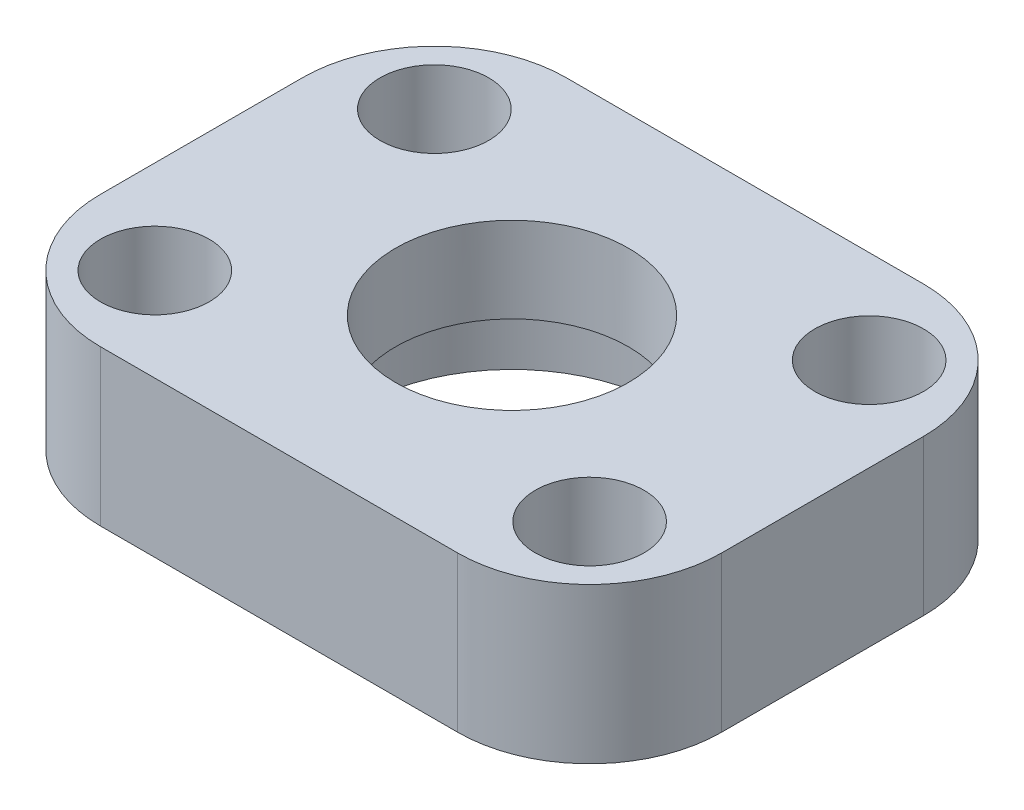
ISO-10303-21;
HEADER;
FILE_DESCRIPTION(('STEP AP214'),'2;1');
FILE_NAME('part.step','',(''),(''),'','','');
FILE_SCHEMA(('AUTOMOTIVE_DESIGN { 1 0 10303 214 1 1 1 1 }'));
ENDSEC;
DATA;
#1=APPLICATION_CONTEXT('core data for automotive mechanical design processes');
#2=APPLICATION_PROTOCOL_DEFINITION('international standard','automotive_design',2000,#1);
#3=PRODUCT_CONTEXT('',#1,'mechanical');
#4=PRODUCT('Part','Part','',(#3));
#5=PRODUCT_RELATED_PRODUCT_CATEGORY('part','',(#4));
#6=PRODUCT_DEFINITION_FORMATION('','',#4);
#7=PRODUCT_DEFINITION_CONTEXT('part definition',#1,'design');
#8=PRODUCT_DEFINITION('design','',#6,#7);
#9=PRODUCT_DEFINITION_SHAPE('','',#8);
#10=(LENGTH_UNIT() NAMED_UNIT(*) SI_UNIT(.MILLI.,.METRE.));
#11=(NAMED_UNIT(*) PLANE_ANGLE_UNIT() SI_UNIT($,.RADIAN.));
#12=(NAMED_UNIT(*) SI_UNIT($,.STERADIAN.) SOLID_ANGLE_UNIT());
#13=UNCERTAINTY_MEASURE_WITH_UNIT(LENGTH_MEASURE(1.E-05),#10,'distance_accuracy_value','');
#14=(GEOMETRIC_REPRESENTATION_CONTEXT(3) GLOBAL_UNCERTAINTY_ASSIGNED_CONTEXT((#13)) GLOBAL_UNIT_ASSIGNED_CONTEXT((#10,
#11,#12)) REPRESENTATION_CONTEXT('',''));
#15=CARTESIAN_POINT('',(0.,0.,0.));
#16=DIRECTION('',(0.,0.,1.));
#17=DIRECTION('',(1.,0.,0.));
#18=AXIS2_PLACEMENT_3D('',#15,#16,#17);
#19=CARTESIAN_POINT('',(14.,10.,-9.));
#20=DIRECTION('',(0.,1.,0.));
#21=DIRECTION('',(0.,0.,1.));
#22=AXIS2_PLACEMENT_3D('',#19,#20,#21);
#23=CYLINDRICAL_SURFACE('',#22,1.5);
#24=CARTESIAN_POINT('',(14.,0.,-9.));
#25=DIRECTION('',(0.,1.,0.));
#26=DIRECTION('',(0.,0.,1.));
#27=AXIS2_PLACEMENT_3D('',#24,#25,#26);
#28=CIRCLE('',#27,1.5);
#29=CARTESIAN_POINT('',(14.,0.,-7.5));
#30=VERTEX_POINT('',#29);
#31=EDGE_CURVE('E197',#30,#30,#28,.T.);
#32=ORIENTED_EDGE('',*,*,#31,.F.);
#33=EDGE_LOOP('',(#32));
#34=FACE_BOUND('',#33,.T.);
#35=CARTESIAN_POINT('',(14.,5.,-9.));
#36=DIRECTION('',(0.,1.,0.));
#37=DIRECTION('',(0.,0.,1.));
#38=AXIS2_PLACEMENT_3D('',#35,#36,#37);
#39=CIRCLE('',#38,1.5);
#40=CARTESIAN_POINT('',(14.,5.,-7.5));
#41=VERTEX_POINT('',#40);
#42=EDGE_CURVE('E40',#41,#41,#39,.F.);
#43=ORIENTED_EDGE('',*,*,#42,.F.);
#44=EDGE_LOOP('',(#43));
#45=FACE_BOUND('',#44,.T.);
#46=ADVANCED_FACE('F36',(#34,#45),#23,.F.);
#47=CARTESIAN_POINT('',(14.,10.,9.));
#48=DIRECTION('',(0.,1.,0.));
#49=DIRECTION('',(0.,0.,1.));
#50=AXIS2_PLACEMENT_3D('',#47,#48,#49);
#51=CYLINDRICAL_SURFACE('',#50,1.5);
#52=CARTESIAN_POINT('',(14.,0.,9.));
#53=DIRECTION('',(0.,1.,0.));
#54=DIRECTION('',(0.,0.,1.));
#55=AXIS2_PLACEMENT_3D('',#52,#53,#54);
#56=CIRCLE('',#55,1.5);
#57=CARTESIAN_POINT('',(14.,0.,10.5));
#58=VERTEX_POINT('',#57);
#59=EDGE_CURVE('E189',#58,#58,#56,.T.);
#60=ORIENTED_EDGE('',*,*,#59,.F.);
#61=EDGE_LOOP('',(#60));
#62=FACE_BOUND('',#61,.T.);
#63=CARTESIAN_POINT('',(14.,5.,9.));
#64=DIRECTION('',(0.,1.,0.));
#65=DIRECTION('',(0.,0.,1.));
#66=AXIS2_PLACEMENT_3D('',#63,#64,#65);
#67=CIRCLE('',#66,1.5);
#68=CARTESIAN_POINT('',(14.,5.,10.5));
#69=VERTEX_POINT('',#68);
#70=EDGE_CURVE('E175',#69,#69,#67,.F.);
#71=ORIENTED_EDGE('',*,*,#70,.F.);
#72=EDGE_LOOP('',(#71));
#73=FACE_BOUND('',#72,.T.);
#74=ADVANCED_FACE('F240',(#62,#73),#51,.F.);
#75=CARTESIAN_POINT('',(-14.,10.,9.));
#76=DIRECTION('',(0.,1.,0.));
#77=DIRECTION('',(0.,0.,1.));
#78=AXIS2_PLACEMENT_3D('',#75,#76,#77);
#79=CYLINDRICAL_SURFACE('',#78,1.5);
#80=CARTESIAN_POINT('',(-14.,0.,9.));
#81=DIRECTION('',(0.,1.,0.));
#82=DIRECTION('',(0.,0.,1.));
#83=AXIS2_PLACEMENT_3D('',#80,#81,#82);
#84=CIRCLE('',#83,1.5);
#85=CARTESIAN_POINT('',(-14.,0.,10.5));
#86=VERTEX_POINT('',#85);
#87=EDGE_CURVE('E184',#86,#86,#84,.T.);
#88=ORIENTED_EDGE('',*,*,#87,.F.);
#89=EDGE_LOOP('',(#88));
#90=FACE_BOUND('',#89,.T.);
#91=CARTESIAN_POINT('',(-14.,5.,9.));
#92=DIRECTION('',(0.,1.,0.));
#93=DIRECTION('',(0.,0.,1.));
#94=AXIS2_PLACEMENT_3D('',#91,#92,#93);
#95=CIRCLE('',#94,1.5);
#96=CARTESIAN_POINT('',(-14.,5.,10.5));
#97=VERTEX_POINT('',#96);
#98=EDGE_CURVE('E172',#97,#97,#95,.F.);
#99=ORIENTED_EDGE('',*,*,#98,.F.);
#100=EDGE_LOOP('',(#99));
#101=FACE_BOUND('',#100,.T.);
#102=ADVANCED_FACE('F246',(#90,#101),#79,.F.);
#103=CARTESIAN_POINT('',(-14.,10.,-9.));
#104=DIRECTION('',(0.,1.,0.));
#105=DIRECTION('',(0.,0.,1.));
#106=AXIS2_PLACEMENT_3D('',#103,#104,#105);
#107=CYLINDRICAL_SURFACE('',#106,1.5);
#108=CARTESIAN_POINT('',(-14.,0.,-9.));
#109=DIRECTION('',(0.,1.,0.));
#110=DIRECTION('',(0.,0.,1.));
#111=AXIS2_PLACEMENT_3D('',#108,#109,#110);
#112=CIRCLE('',#111,1.5);
#113=CARTESIAN_POINT('',(-14.,0.,-7.5));
#114=VERTEX_POINT('',#113);
#115=EDGE_CURVE('E180',#114,#114,#112,.T.);
#116=ORIENTED_EDGE('',*,*,#115,.F.);
#117=EDGE_LOOP('',(#116));
#118=FACE_BOUND('',#117,.T.);
#119=CARTESIAN_POINT('',(-14.,5.,-9.));
#120=DIRECTION('',(0.,1.,0.));
#121=DIRECTION('',(0.,0.,1.));
#122=AXIS2_PLACEMENT_3D('',#119,#120,#121);
#123=CIRCLE('',#122,1.5);
#124=CARTESIAN_POINT('',(-14.,5.,-7.5));
#125=VERTEX_POINT('',#124);
#126=EDGE_CURVE('E169',#125,#125,#123,.F.);
#127=ORIENTED_EDGE('',*,*,#126,.F.);
#128=EDGE_LOOP('',(#127));
#129=FACE_BOUND('',#128,.T.);
#130=ADVANCED_FACE('F278',(#118,#129),#107,.F.);
#131=CARTESIAN_POINT('',(20.,10.,-15.));
#132=DIRECTION('',(-1.,0.,0.));
#133=DIRECTION('',(0.,0.,1.));
#134=AXIS2_PLACEMENT_3D('',#131,#132,#133);
#135=PLANE('',#134);
#136=DIRECTION('',(0.,0.,-1.));
#137=VECTOR('',#136,1.);
#138=CARTESIAN_POINT('',(20.,0.,-15.));
#139=LINE('',#138,#137);
#140=CARTESIAN_POINT('',(20.,0.,6.5));
#141=VERTEX_POINT('',#140);
#142=CARTESIAN_POINT('',(20.,0.,-6.5));
#143=VERTEX_POINT('',#142);
#144=EDGE_CURVE('E131',#141,#143,#139,.T.);
#145=ORIENTED_EDGE('',*,*,#144,.T.);
#146=DIRECTION('',(0.,-1.,0.));
#147=VECTOR('',#146,1.);
#148=CARTESIAN_POINT('',(20.,10.,-6.5));
#149=LINE('',#148,#147);
#150=CARTESIAN_POINT('',(20.,10.,-6.5));
#151=VERTEX_POINT('',#150);
#152=EDGE_CURVE('E109',#143,#151,#149,.F.);
#153=ORIENTED_EDGE('',*,*,#152,.T.);
#154=DIRECTION('',(0.,0.,-1.));
#155=VECTOR('',#154,1.);
#156=CARTESIAN_POINT('',(20.,10.,-15.));
#157=LINE('',#156,#155);
#158=CARTESIAN_POINT('',(20.,10.,6.5));
#159=VERTEX_POINT('',#158);
#160=EDGE_CURVE('E141',#159,#151,#157,.T.);
#161=ORIENTED_EDGE('',*,*,#160,.F.);
#162=DIRECTION('',(0.,-1.,0.));
#163=VECTOR('',#162,1.);
#164=CARTESIAN_POINT('',(20.,10.,6.5));
#165=LINE('',#164,#163);
#166=EDGE_CURVE('E114',#159,#141,#165,.T.);
#167=ORIENTED_EDGE('',*,*,#166,.T.);
#168=EDGE_LOOP('',(#145,#153,#161,#167));
#169=FACE_BOUND('',#168,.T.);
#170=ADVANCED_FACE('F218',(#169),#135,.F.);
#171=CARTESIAN_POINT('',(-20.,10.,-15.));
#172=DIRECTION('',(0.,0.,1.));
#173=DIRECTION('',(1.,0.,0.));
#174=AXIS2_PLACEMENT_3D('',#171,#172,#173);
#175=PLANE('',#174);
#176=DIRECTION('',(-1.,0.,0.));
#177=VECTOR('',#176,1.);
#178=CARTESIAN_POINT('',(-20.,10.,-15.));
#179=LINE('',#178,#177);
#180=CARTESIAN_POINT('',(11.5,10.,-15.));
#181=VERTEX_POINT('',#180);
#182=CARTESIAN_POINT('',(-11.5,10.,-15.));
#183=VERTEX_POINT('',#182);
#184=EDGE_CURVE('E124',#181,#183,#179,.T.);
#185=ORIENTED_EDGE('',*,*,#184,.F.);
#186=DIRECTION('',(0.,-1.,0.));
#187=VECTOR('',#186,1.);
#188=CARTESIAN_POINT('',(11.5,10.,-15.));
#189=LINE('',#188,#187);
#190=CARTESIAN_POINT('',(11.5,0.,-15.));
#191=VERTEX_POINT('',#190);
#192=EDGE_CURVE('E108',#181,#191,#189,.T.);
#193=ORIENTED_EDGE('',*,*,#192,.T.);
#194=DIRECTION('',(-1.,0.,0.));
#195=VECTOR('',#194,1.);
#196=CARTESIAN_POINT('',(-20.,0.,-15.));
#197=LINE('',#196,#195);
#198=CARTESIAN_POINT('',(-11.5,0.,-15.));
#199=VERTEX_POINT('',#198);
#200=EDGE_CURVE('E121',#191,#199,#197,.T.);
#201=ORIENTED_EDGE('',*,*,#200,.T.);
#202=DIRECTION('',(0.,-1.,0.));
#203=VECTOR('',#202,1.);
#204=CARTESIAN_POINT('',(-11.5,10.,-15.));
#205=LINE('',#204,#203);
#206=EDGE_CURVE('E126',#199,#183,#205,.F.);
#207=ORIENTED_EDGE('',*,*,#206,.T.);
#208=EDGE_LOOP('',(#185,#193,#201,#207));
#209=FACE_BOUND('',#208,.T.);
#210=ADVANCED_FACE('F120',(#209),#175,.F.);
#211=CARTESIAN_POINT('',(-20.,10.,-15.));
#212=DIRECTION('',(1.,0.,0.));
#213=DIRECTION('',(0.,0.,-1.));
#214=AXIS2_PLACEMENT_3D('',#211,#212,#213);
#215=PLANE('',#214);
#216=DIRECTION('',(0.,0.,1.));
#217=VECTOR('',#216,1.);
#218=CARTESIAN_POINT('',(-20.,0.,-15.));
#219=LINE('',#218,#217);
#220=CARTESIAN_POINT('',(-20.,0.,-6.5));
#221=VERTEX_POINT('',#220);
#222=CARTESIAN_POINT('',(-20.,0.,6.5));
#223=VERTEX_POINT('',#222);
#224=EDGE_CURVE('E130',#221,#223,#219,.T.);
#225=ORIENTED_EDGE('',*,*,#224,.T.);
#226=DIRECTION('',(0.,-1.,0.));
#227=VECTOR('',#226,1.);
#228=CARTESIAN_POINT('',(-20.,10.,6.5));
#229=LINE('',#228,#227);
#230=CARTESIAN_POINT('',(-20.,10.,6.5));
#231=VERTEX_POINT('',#230);
#232=EDGE_CURVE('E11',#223,#231,#229,.F.);
#233=ORIENTED_EDGE('',*,*,#232,.T.);
#234=DIRECTION('',(0.,0.,1.));
#235=VECTOR('',#234,1.);
#236=CARTESIAN_POINT('',(-20.,10.,-15.));
#237=LINE('',#236,#235);
#238=CARTESIAN_POINT('',(-20.,10.,-6.5));
#239=VERTEX_POINT('',#238);
#240=EDGE_CURVE('E209',#239,#231,#237,.T.);
#241=ORIENTED_EDGE('',*,*,#240,.F.);
#242=DIRECTION('',(0.,-1.,0.));
#243=VECTOR('',#242,1.);
#244=CARTESIAN_POINT('',(-20.,10.,-6.5));
#245=LINE('',#244,#243);
#246=EDGE_CURVE('E45',#239,#221,#245,.T.);
#247=ORIENTED_EDGE('',*,*,#246,.T.);
#248=EDGE_LOOP('',(#225,#233,#241,#247));
#249=FACE_BOUND('',#248,.T.);
#250=ADVANCED_FACE('F225',(#249),#215,.F.);
#251=CARTESIAN_POINT('',(-20.,10.,15.));
#252=DIRECTION('',(0.,0.,-1.));
#253=DIRECTION('',(-1.,0.,0.));
#254=AXIS2_PLACEMENT_3D('',#251,#252,#253);
#255=PLANE('',#254);
#256=DIRECTION('',(1.,0.,0.));
#257=VECTOR('',#256,1.);
#258=CARTESIAN_POINT('',(-20.,0.,15.));
#259=LINE('',#258,#257);
#260=CARTESIAN_POINT('',(-11.5,0.,15.));
#261=VERTEX_POINT('',#260);
#262=CARTESIAN_POINT('',(11.5,0.,15.));
#263=VERTEX_POINT('',#262);
#264=EDGE_CURVE('E134',#261,#263,#259,.T.);
#265=ORIENTED_EDGE('',*,*,#264,.T.);
#266=DIRECTION('',(0.,-1.,0.));
#267=VECTOR('',#266,1.);
#268=CARTESIAN_POINT('',(11.5,10.,15.));
#269=LINE('',#268,#267);
#270=CARTESIAN_POINT('',(11.5,10.,15.));
#271=VERTEX_POINT('',#270);
#272=EDGE_CURVE('E53',#263,#271,#269,.F.);
#273=ORIENTED_EDGE('',*,*,#272,.T.);
#274=DIRECTION('',(1.,0.,0.));
#275=VECTOR('',#274,1.);
#276=CARTESIAN_POINT('',(-20.,10.,15.));
#277=LINE('',#276,#275);
#278=CARTESIAN_POINT('',(-11.5,10.,15.));
#279=VERTEX_POINT('',#278);
#280=EDGE_CURVE('E147',#279,#271,#277,.T.);
#281=ORIENTED_EDGE('',*,*,#280,.F.);
#282=DIRECTION('',(0.,-1.,0.));
#283=VECTOR('',#282,1.);
#284=CARTESIAN_POINT('',(-11.5,10.,15.));
#285=LINE('',#284,#283);
#286=EDGE_CURVE('E163',#279,#261,#285,.T.);
#287=ORIENTED_EDGE('',*,*,#286,.T.);
#288=EDGE_LOOP('',(#265,#273,#281,#287));
#289=FACE_BOUND('',#288,.T.);
#290=ADVANCED_FACE('F220',(#289),#255,.F.);
#291=CARTESIAN_POINT('',(0.,10.,0.));
#292=DIRECTION('',(0.,1.,0.));
#293=DIRECTION('',(0.,0.,1.));
#294=AXIS2_PLACEMENT_3D('',#291,#292,#293);
#295=PLANE('',#294);
#296=CARTESIAN_POINT('',(13.9999999999999,10.,-9.));
#297=DIRECTION('',(0.,1.,0.));
#298=DIRECTION('',(0.,0.,1.));
#299=AXIS2_PLACEMENT_3D('',#296,#297,#298);
#300=CIRCLE('',#299,3.5);
#301=CARTESIAN_POINT('',(13.9999999999999,10.,-5.5));
#302=VERTEX_POINT('',#301);
#303=EDGE_CURVE('E414',#302,#302,#300,.T.);
#304=ORIENTED_EDGE('',*,*,#303,.F.);
#305=EDGE_LOOP('',(#304));
#306=FACE_BOUND('',#305,.T.);
#307=CARTESIAN_POINT('',(-14.0000000000001,10.,-8.9999999999998));
#308=DIRECTION('',(0.,1.,0.));
#309=DIRECTION('',(0.,0.,1.));
#310=AXIS2_PLACEMENT_3D('',#307,#308,#309);
#311=CIRCLE('',#310,3.5);
#312=CARTESIAN_POINT('',(-14.0000000000001,10.,-5.49999999999981));
#313=VERTEX_POINT('',#312);
#314=EDGE_CURVE('E416',#313,#313,#311,.T.);
#315=ORIENTED_EDGE('',*,*,#314,.F.);
#316=EDGE_LOOP('',(#315));
#317=FACE_BOUND('',#316,.T.);
#318=CARTESIAN_POINT('',(-14.,10.,9.0000000000002));
#319=DIRECTION('',(0.,1.,0.));
#320=DIRECTION('',(0.,0.,1.));
#321=AXIS2_PLACEMENT_3D('',#318,#319,#320);
#322=CIRCLE('',#321,3.5);
#323=CARTESIAN_POINT('',(-14.,10.,12.5000000000002));
#324=VERTEX_POINT('',#323);
#325=EDGE_CURVE('E426',#324,#324,#322,.T.);
#326=ORIENTED_EDGE('',*,*,#325,.F.);
#327=EDGE_LOOP('',(#326));
#328=FACE_BOUND('',#327,.T.);
#329=CARTESIAN_POINT('',(14.,10.,9.));
#330=DIRECTION('',(0.,1.,0.));
#331=DIRECTION('',(0.,0.,1.));
#332=AXIS2_PLACEMENT_3D('',#329,#330,#331);
#333=CIRCLE('',#332,3.5);
#334=CARTESIAN_POINT('',(14.,10.,12.5));
#335=VERTEX_POINT('',#334);
#336=EDGE_CURVE('E192',#335,#335,#333,.T.);
#337=ORIENTED_EDGE('',*,*,#336,.F.);
#338=EDGE_LOOP('',(#337));
#339=FACE_BOUND('',#338,.T.);
#340=CARTESIAN_POINT('',(0.,10.,0.));
#341=DIRECTION('',(0.,1.,0.));
#342=DIRECTION('',(0.,0.,1.));
#343=AXIS2_PLACEMENT_3D('',#340,#341,#342);
#344=CIRCLE('',#343,7.5);
#345=CARTESIAN_POINT('',(0.,10.,7.5));
#346=VERTEX_POINT('',#345);
#347=EDGE_CURVE('E146',#346,#346,#344,.T.);
#348=ORIENTED_EDGE('',*,*,#347,.F.);
#349=EDGE_LOOP('',(#348));
#350=FACE_BOUND('',#349,.T.);
#351=ORIENTED_EDGE('',*,*,#160,.T.);
#352=CARTESIAN_POINT('',(11.5,10.,-6.5));
#353=DIRECTION('',(0.,1.,0.));
#354=DIRECTION('',(0.,0.,1.));
#355=AXIS2_PLACEMENT_3D('',#352,#353,#354);
#356=CIRCLE('',#355,8.5);
#357=EDGE_CURVE('E161',#151,#181,#356,.T.);
#358=ORIENTED_EDGE('',*,*,#357,.T.);
#359=ORIENTED_EDGE('',*,*,#184,.T.);
#360=CARTESIAN_POINT('',(-11.5,10.,-6.5));
#361=DIRECTION('',(0.,1.,0.));
#362=DIRECTION('',(0.,0.,1.));
#363=AXIS2_PLACEMENT_3D('',#360,#361,#362);
#364=CIRCLE('',#363,8.5);
#365=EDGE_CURVE('E156',#183,#239,#364,.T.);
#366=ORIENTED_EDGE('',*,*,#365,.T.);
#367=ORIENTED_EDGE('',*,*,#240,.T.);
#368=CARTESIAN_POINT('',(-11.5,10.,6.5));
#369=DIRECTION('',(0.,1.,0.));
#370=DIRECTION('',(0.,0.,1.));
#371=AXIS2_PLACEMENT_3D('',#368,#369,#370);
#372=CIRCLE('',#371,8.5);
#373=EDGE_CURVE('E60',#231,#279,#372,.T.);
#374=ORIENTED_EDGE('',*,*,#373,.T.);
#375=ORIENTED_EDGE('',*,*,#280,.T.);
#376=CARTESIAN_POINT('',(11.5,10.,6.5));
#377=DIRECTION('',(0.,1.,0.));
#378=DIRECTION('',(0.,0.,1.));
#379=AXIS2_PLACEMENT_3D('',#376,#377,#378);
#380=CIRCLE('',#379,8.5);
#381=EDGE_CURVE('E159',#271,#159,#380,.T.);
#382=ORIENTED_EDGE('',*,*,#381,.T.);
#383=EDGE_LOOP('',(#351,#358,#359,#366,#367,#374,#375,#382));
#384=FACE_BOUND('',#383,.T.);
#385=ADVANCED_FACE('F211',(#306,#317,#328,#339,#350,#384),#295,.T.);
#386=CARTESIAN_POINT('',(0.,0.,0.));
#387=DIRECTION('',(0.,1.,0.));
#388=DIRECTION('',(0.,0.,1.));
#389=AXIS2_PLACEMENT_3D('',#386,#387,#388);
#390=PLANE('',#389);
#391=ORIENTED_EDGE('',*,*,#115,.T.);
#392=EDGE_LOOP('',(#391));
#393=FACE_BOUND('',#392,.T.);
#394=ORIENTED_EDGE('',*,*,#87,.T.);
#395=EDGE_LOOP('',(#394));
#396=FACE_BOUND('',#395,.T.);
#397=ORIENTED_EDGE('',*,*,#59,.T.);
#398=EDGE_LOOP('',(#397));
#399=FACE_BOUND('',#398,.T.);
#400=ORIENTED_EDGE('',*,*,#31,.T.);
#401=EDGE_LOOP('',(#400));
#402=FACE_BOUND('',#401,.T.);
#403=CARTESIAN_POINT('',(0.,0.,0.));
#404=DIRECTION('',(0.,-1.,0.));
#405=DIRECTION('',(0.,0.,-1.));
#406=AXIS2_PLACEMENT_3D('',#403,#404,#405);
#407=CIRCLE('',#406,9.875);
#408=CARTESIAN_POINT('',(0.,0.,-9.875));
#409=VERTEX_POINT('',#408);
#410=EDGE_CURVE('E145',#409,#409,#407,.T.);
#411=ORIENTED_EDGE('',*,*,#410,.F.);
#412=EDGE_LOOP('',(#411));
#413=FACE_BOUND('',#412,.T.);
#414=ORIENTED_EDGE('',*,*,#200,.F.);
#415=CARTESIAN_POINT('',(11.5,0.,-6.5));
#416=DIRECTION('',(0.,1.,0.));
#417=DIRECTION('',(0.,0.,1.));
#418=AXIS2_PLACEMENT_3D('',#415,#416,#417);
#419=CIRCLE('',#418,8.5);
#420=EDGE_CURVE('E104',#191,#143,#419,.F.);
#421=ORIENTED_EDGE('',*,*,#420,.T.);
#422=ORIENTED_EDGE('',*,*,#144,.F.);
#423=CARTESIAN_POINT('',(11.5,0.,6.5));
#424=DIRECTION('',(0.,1.,0.));
#425=DIRECTION('',(0.,0.,1.));
#426=AXIS2_PLACEMENT_3D('',#423,#424,#425);
#427=CIRCLE('',#426,8.5);
#428=EDGE_CURVE('E115',#141,#263,#427,.F.);
#429=ORIENTED_EDGE('',*,*,#428,.T.);
#430=ORIENTED_EDGE('',*,*,#264,.F.);
#431=CARTESIAN_POINT('',(-11.5,0.,6.5));
#432=DIRECTION('',(0.,1.,0.));
#433=DIRECTION('',(0.,0.,1.));
#434=AXIS2_PLACEMENT_3D('',#431,#432,#433);
#435=CIRCLE('',#434,8.5);
#436=EDGE_CURVE('E150',#261,#223,#435,.F.);
#437=ORIENTED_EDGE('',*,*,#436,.T.);
#438=ORIENTED_EDGE('',*,*,#224,.F.);
#439=CARTESIAN_POINT('',(-11.5,0.,-6.5));
#440=DIRECTION('',(0.,1.,0.));
#441=DIRECTION('',(0.,0.,1.));
#442=AXIS2_PLACEMENT_3D('',#439,#440,#441);
#443=CIRCLE('',#442,8.5);
#444=EDGE_CURVE('E125',#221,#199,#443,.F.);
#445=ORIENTED_EDGE('',*,*,#444,.T.);
#446=EDGE_LOOP('',(#414,#421,#422,#429,#430,#437,#438,#445));
#447=FACE_BOUND('',#446,.T.);
#448=ADVANCED_FACE('F128',(#393,#396,#399,#402,#413,#447),#390,.F.);
#449=CARTESIAN_POINT('',(0.,4.5,0.));
#450=DIRECTION('',(0.,-1.,0.));
#451=DIRECTION('',(0.,0.,-1.));
#452=AXIS2_PLACEMENT_3D('',#449,#450,#451);
#453=CYLINDRICAL_SURFACE('',#452,9.875);
#454=CARTESIAN_POINT('',(0.,4.5,0.));
#455=DIRECTION('',(0.,-1.,0.));
#456=DIRECTION('',(0.,0.,-1.));
#457=AXIS2_PLACEMENT_3D('',#454,#455,#456);
#458=CIRCLE('',#457,9.875);
#459=CARTESIAN_POINT('',(0.,4.5,-9.875));
#460=VERTEX_POINT('',#459);
#461=EDGE_CURVE('E136',#460,#460,#458,.T.);
#462=ORIENTED_EDGE('',*,*,#461,.F.);
#463=EDGE_LOOP('',(#462));
#464=FACE_BOUND('',#463,.T.);
#465=ORIENTED_EDGE('',*,*,#410,.T.);
#466=EDGE_LOOP('',(#465));
#467=FACE_BOUND('',#466,.T.);
#468=ADVANCED_FACE('F260',(#464,#467),#453,.F.);
#469=CARTESIAN_POINT('',(0.,4.5,0.));
#470=DIRECTION('',(0.,-1.,0.));
#471=DIRECTION('',(0.,0.,-1.));
#472=AXIS2_PLACEMENT_3D('',#469,#470,#471);
#473=PLANE('',#472);
#474=CARTESIAN_POINT('',(0.,4.5,0.));
#475=DIRECTION('',(0.,-1.,0.));
#476=DIRECTION('',(0.,0.,-1.));
#477=AXIS2_PLACEMENT_3D('',#474,#475,#476);
#478=CIRCLE('',#477,7.5);
#479=CARTESIAN_POINT('',(0.,4.5,-7.5));
#480=VERTEX_POINT('',#479);
#481=EDGE_CURVE('E142',#480,#480,#478,.T.);
#482=ORIENTED_EDGE('',*,*,#481,.F.);
#483=EDGE_LOOP('',(#482));
#484=FACE_BOUND('',#483,.T.);
#485=ORIENTED_EDGE('',*,*,#461,.T.);
#486=EDGE_LOOP('',(#485));
#487=FACE_BOUND('',#486,.T.);
#488=ADVANCED_FACE('F256',(#484,#487),#473,.T.);
#489=CARTESIAN_POINT('',(0.,0.,0.));
#490=DIRECTION('',(0.,1.,0.));
#491=DIRECTION('',(0.,0.,1.));
#492=AXIS2_PLACEMENT_3D('',#489,#490,#491);
#493=CYLINDRICAL_SURFACE('',#492,7.5);
#494=ORIENTED_EDGE('',*,*,#481,.T.);
#495=EDGE_LOOP('',(#494));
#496=FACE_BOUND('',#495,.T.);
#497=ORIENTED_EDGE('',*,*,#347,.T.);
#498=EDGE_LOOP('',(#497));
#499=FACE_BOUND('',#498,.T.);
#500=ADVANCED_FACE('F253',(#496,#499),#493,.F.);
#501=CARTESIAN_POINT('',(11.5,10.,-6.5));
#502=DIRECTION('',(0.,-1.,0.));
#503=DIRECTION('',(0.,0.,-1.));
#504=AXIS2_PLACEMENT_3D('',#501,#502,#503);
#505=CYLINDRICAL_SURFACE('',#504,8.5);
#506=ORIENTED_EDGE('',*,*,#357,.F.);
#507=ORIENTED_EDGE('',*,*,#152,.F.);
#508=ORIENTED_EDGE('',*,*,#420,.F.);
#509=ORIENTED_EDGE('',*,*,#192,.F.);
#510=EDGE_LOOP('',(#506,#507,#508,#509));
#511=FACE_BOUND('',#510,.T.);
#512=ADVANCED_FACE('F107',(#511),#505,.T.);
#513=CARTESIAN_POINT('',(11.5,10.,6.5));
#514=DIRECTION('',(0.,-1.,0.));
#515=DIRECTION('',(0.,0.,-1.));
#516=AXIS2_PLACEMENT_3D('',#513,#514,#515);
#517=CYLINDRICAL_SURFACE('',#516,8.5);
#518=ORIENTED_EDGE('',*,*,#381,.F.);
#519=ORIENTED_EDGE('',*,*,#272,.F.);
#520=ORIENTED_EDGE('',*,*,#428,.F.);
#521=ORIENTED_EDGE('',*,*,#166,.F.);
#522=EDGE_LOOP('',(#518,#519,#520,#521));
#523=FACE_BOUND('',#522,.T.);
#524=ADVANCED_FACE('F216',(#523),#517,.T.);
#525=CARTESIAN_POINT('',(-11.5,10.,6.5));
#526=DIRECTION('',(0.,-1.,0.));
#527=DIRECTION('',(0.,0.,-1.));
#528=AXIS2_PLACEMENT_3D('',#525,#526,#527);
#529=CYLINDRICAL_SURFACE('',#528,8.5);
#530=ORIENTED_EDGE('',*,*,#373,.F.);
#531=ORIENTED_EDGE('',*,*,#232,.F.);
#532=ORIENTED_EDGE('',*,*,#436,.F.);
#533=ORIENTED_EDGE('',*,*,#286,.F.);
#534=EDGE_LOOP('',(#530,#531,#532,#533));
#535=FACE_BOUND('',#534,.T.);
#536=ADVANCED_FACE('F222',(#535),#529,.T.);
#537=CARTESIAN_POINT('',(-11.5,10.,-6.5));
#538=DIRECTION('',(0.,-1.,0.));
#539=DIRECTION('',(0.,0.,-1.));
#540=AXIS2_PLACEMENT_3D('',#537,#538,#539);
#541=CYLINDRICAL_SURFACE('',#540,8.5);
#542=ORIENTED_EDGE('',*,*,#365,.F.);
#543=ORIENTED_EDGE('',*,*,#206,.F.);
#544=ORIENTED_EDGE('',*,*,#444,.F.);
#545=ORIENTED_EDGE('',*,*,#246,.F.);
#546=EDGE_LOOP('',(#542,#543,#544,#545));
#547=FACE_BOUND('',#546,.T.);
#548=ADVANCED_FACE('F38',(#547),#541,.T.);
#549=CARTESIAN_POINT('',(-14.0000000000001,5.,-8.9999999999998));
#550=DIRECTION('',(0.,1.,0.));
#551=DIRECTION('',(0.,0.,1.));
#552=AXIS2_PLACEMENT_3D('',#549,#550,#551);
#553=PLANE('',#552);
#554=CARTESIAN_POINT('',(-14.0000000000001,5.,-8.9999999999998));
#555=DIRECTION('',(0.,1.,0.));
#556=DIRECTION('',(0.,0.,1.));
#557=AXIS2_PLACEMENT_3D('',#554,#555,#556);
#558=CIRCLE('',#557,3.5);
#559=CARTESIAN_POINT('',(-14.0000000000001,5.,-5.49999999999981));
#560=VERTEX_POINT('',#559);
#561=EDGE_CURVE('E430',#560,#560,#558,.T.);
#562=ORIENTED_EDGE('',*,*,#561,.T.);
#563=EDGE_LOOP('',(#562));
#564=FACE_BOUND('',#563,.T.);
#565=ORIENTED_EDGE('',*,*,#126,.T.);
#566=EDGE_LOOP('',(#565));
#567=FACE_BOUND('',#566,.T.);
#568=ADVANCED_FACE('F231',(#564,#567),#553,.T.);
#569=CARTESIAN_POINT('',(-14.0000000000001,5.,-8.9999999999998));
#570=DIRECTION('',(0.,1.,0.));
#571=DIRECTION('',(0.,0.,1.));
#572=AXIS2_PLACEMENT_3D('',#569,#570,#571);
#573=CYLINDRICAL_SURFACE('',#572,3.5);
#574=ORIENTED_EDGE('',*,*,#561,.F.);
#575=EDGE_LOOP('',(#574));
#576=FACE_BOUND('',#575,.T.);
#577=ORIENTED_EDGE('',*,*,#314,.T.);
#578=EDGE_LOOP('',(#577));
#579=FACE_BOUND('',#578,.T.);
#580=ADVANCED_FACE('F236',(#576,#579),#573,.F.);
#581=CARTESIAN_POINT('',(-14.,5.,9.0000000000002));
#582=DIRECTION('',(0.,1.,0.));
#583=DIRECTION('',(0.,0.,1.));
#584=AXIS2_PLACEMENT_3D('',#581,#582,#583);
#585=PLANE('',#584);
#586=CARTESIAN_POINT('',(-14.,5.,9.0000000000002));
#587=DIRECTION('',(0.,1.,0.));
#588=DIRECTION('',(0.,0.,1.));
#589=AXIS2_PLACEMENT_3D('',#586,#587,#588);
#590=CIRCLE('',#589,3.5);
#591=CARTESIAN_POINT('',(-14.,5.,12.5000000000002));
#592=VERTEX_POINT('',#591);
#593=EDGE_CURVE('E422',#592,#592,#590,.T.);
#594=ORIENTED_EDGE('',*,*,#593,.T.);
#595=EDGE_LOOP('',(#594));
#596=FACE_BOUND('',#595,.T.);
#597=ORIENTED_EDGE('',*,*,#98,.T.);
#598=EDGE_LOOP('',(#597));
#599=FACE_BOUND('',#598,.T.);
#600=ADVANCED_FACE('F344',(#596,#599),#585,.T.);
#601=CARTESIAN_POINT('',(-14.,5.,9.0000000000002));
#602=DIRECTION('',(0.,1.,0.));
#603=DIRECTION('',(0.,0.,1.));
#604=AXIS2_PLACEMENT_3D('',#601,#602,#603);
#605=CYLINDRICAL_SURFACE('',#604,3.5);
#606=ORIENTED_EDGE('',*,*,#593,.F.);
#607=EDGE_LOOP('',(#606));
#608=FACE_BOUND('',#607,.T.);
#609=ORIENTED_EDGE('',*,*,#325,.T.);
#610=EDGE_LOOP('',(#609));
#611=FACE_BOUND('',#610,.T.);
#612=ADVANCED_FACE('F354',(#608,#611),#605,.F.);
#613=CARTESIAN_POINT('',(14.,5.,9.));
#614=DIRECTION('',(0.,1.,0.));
#615=DIRECTION('',(0.,0.,1.));
#616=AXIS2_PLACEMENT_3D('',#613,#614,#615);
#617=PLANE('',#616);
#618=CARTESIAN_POINT('',(14.,5.,9.));
#619=DIRECTION('',(0.,1.,0.));
#620=DIRECTION('',(0.,0.,1.));
#621=AXIS2_PLACEMENT_3D('',#618,#619,#620);
#622=CIRCLE('',#621,3.5);
#623=CARTESIAN_POINT('',(14.,5.,12.5));
#624=VERTEX_POINT('',#623);
#625=EDGE_CURVE('E173',#624,#624,#622,.T.);
#626=ORIENTED_EDGE('',*,*,#625,.T.);
#627=EDGE_LOOP('',(#626));
#628=FACE_BOUND('',#627,.T.);
#629=ORIENTED_EDGE('',*,*,#70,.T.);
#630=EDGE_LOOP('',(#629));
#631=FACE_BOUND('',#630,.T.);
#632=ADVANCED_FACE('F364',(#628,#631),#617,.T.);
#633=CARTESIAN_POINT('',(14.,5.,9.));
#634=DIRECTION('',(0.,1.,0.));
#635=DIRECTION('',(0.,0.,1.));
#636=AXIS2_PLACEMENT_3D('',#633,#634,#635);
#637=CYLINDRICAL_SURFACE('',#636,3.5);
#638=ORIENTED_EDGE('',*,*,#625,.F.);
#639=EDGE_LOOP('',(#638));
#640=FACE_BOUND('',#639,.T.);
#641=ORIENTED_EDGE('',*,*,#336,.T.);
#642=EDGE_LOOP('',(#641));
#643=FACE_BOUND('',#642,.T.);
#644=ADVANCED_FACE('F374',(#640,#643),#637,.F.);
#645=CARTESIAN_POINT('',(13.9999999999999,5.,-9.));
#646=DIRECTION('',(0.,1.,0.));
#647=DIRECTION('',(0.,0.,1.));
#648=AXIS2_PLACEMENT_3D('',#645,#646,#647);
#649=PLANE('',#648);
#650=CARTESIAN_POINT('',(13.9999999999999,5.,-9.));
#651=DIRECTION('',(0.,1.,0.));
#652=DIRECTION('',(0.,0.,1.));
#653=AXIS2_PLACEMENT_3D('',#650,#651,#652);
#654=CIRCLE('',#653,3.5);
#655=CARTESIAN_POINT('',(13.9999999999999,5.,-5.5));
#656=VERTEX_POINT('',#655);
#657=EDGE_CURVE('E411',#656,#656,#654,.T.);
#658=ORIENTED_EDGE('',*,*,#657,.T.);
#659=EDGE_LOOP('',(#658));
#660=FACE_BOUND('',#659,.T.);
#661=ORIENTED_EDGE('',*,*,#42,.T.);
#662=EDGE_LOOP('',(#661));
#663=FACE_BOUND('',#662,.T.);
#664=ADVANCED_FACE('F384',(#660,#663),#649,.T.);
#665=CARTESIAN_POINT('',(13.9999999999999,5.,-9.));
#666=DIRECTION('',(0.,1.,0.));
#667=DIRECTION('',(0.,0.,1.));
#668=AXIS2_PLACEMENT_3D('',#665,#666,#667);
#669=CYLINDRICAL_SURFACE('',#668,3.5);
#670=ORIENTED_EDGE('',*,*,#657,.F.);
#671=EDGE_LOOP('',(#670));
#672=FACE_BOUND('',#671,.T.);
#673=ORIENTED_EDGE('',*,*,#303,.T.);
#674=EDGE_LOOP('',(#673));
#675=FACE_BOUND('',#674,.T.);
#676=ADVANCED_FACE('F394',(#672,#675),#669,.F.);
#677=CLOSED_SHELL('',(#46,#74,#102,#130,#170,#210,#250,#290,#385,#448,#468,#488,#500,#512,#524,
#536,#548,#568,#580,#600,#612,#632,#644,#664,#676));
#678=MANIFOLD_SOLID_BREP('B2',#677);
#679=ADVANCED_BREP_SHAPE_REPRESENTATION('',(#18,#678),#14);
#680=SHAPE_DEFINITION_REPRESENTATION(#9,#679);
ENDSEC;
END-ISO-10303-21;
